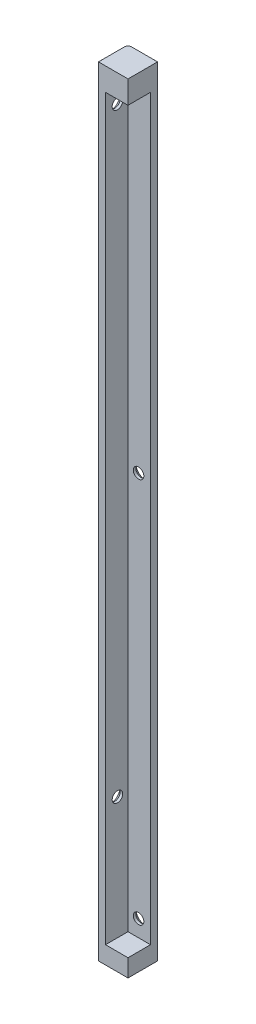
ISO-10303-21;
HEADER;
FILE_DESCRIPTION(('STEP AP214'),'2;1');
FILE_NAME('part.step','',(''),(''),'','','');
FILE_SCHEMA(('AUTOMOTIVE_DESIGN { 1 0 10303 214 1 1 1 1 }'));
ENDSEC;
DATA;
#1=APPLICATION_CONTEXT('core data for automotive mechanical design processes');
#2=APPLICATION_PROTOCOL_DEFINITION('international standard','automotive_design',2000,#1);
#3=PRODUCT_CONTEXT('',#1,'mechanical');
#4=PRODUCT('Part','Part','',(#3));
#5=PRODUCT_RELATED_PRODUCT_CATEGORY('part','',(#4));
#6=PRODUCT_DEFINITION_FORMATION('','',#4);
#7=PRODUCT_DEFINITION_CONTEXT('part definition',#1,'design');
#8=PRODUCT_DEFINITION('design','',#6,#7);
#9=PRODUCT_DEFINITION_SHAPE('','',#8);
#10=(LENGTH_UNIT() NAMED_UNIT(*) SI_UNIT(.MILLI.,.METRE.));
#11=(NAMED_UNIT(*) PLANE_ANGLE_UNIT() SI_UNIT($,.RADIAN.));
#12=(NAMED_UNIT(*) SI_UNIT($,.STERADIAN.) SOLID_ANGLE_UNIT());
#13=UNCERTAINTY_MEASURE_WITH_UNIT(LENGTH_MEASURE(1.E-05),#10,'distance_accuracy_value','');
#14=(GEOMETRIC_REPRESENTATION_CONTEXT(3) GLOBAL_UNCERTAINTY_ASSIGNED_CONTEXT((#13)) GLOBAL_UNIT_ASSIGNED_CONTEXT((#10,
#11,#12)) REPRESENTATION_CONTEXT('',''));
#15=CARTESIAN_POINT('',(0.,0.,0.));
#16=DIRECTION('',(0.,0.,1.));
#17=DIRECTION('',(1.,0.,0.));
#18=AXIS2_PLACEMENT_3D('',#15,#16,#17);
#19=CARTESIAN_POINT('',(2.,221.5,0.));
#20=DIRECTION('',(-1.,0.,0.));
#21=DIRECTION('',(0.,0.,1.));
#22=AXIS2_PLACEMENT_3D('',#19,#20,#21);
#23=PLANE('',#22);
#24=CARTESIAN_POINT('',(2.,210.999999999999,-4.00000000000108));
#25=DIRECTION('',(-1.,0.,0.));
#26=DIRECTION('',(0.,0.,1.));
#27=AXIS2_PLACEMENT_3D('',#24,#25,#26);
#28=CIRCLE('',#27,1.5);
#29=CARTESIAN_POINT('',(2.,210.999999999999,-2.50000000000108));
#30=VERTEX_POINT('',#29);
#31=EDGE_CURVE('E186',#30,#30,#28,.T.);
#32=ORIENTED_EDGE('',*,*,#31,.T.);
#33=EDGE_LOOP('',(#32));
#34=FACE_BOUND('',#33,.T.);
#35=CARTESIAN_POINT('',(2.,40.249999999999,-3.99999999999999));
#36=DIRECTION('',(-1.,0.,0.));
#37=DIRECTION('',(0.,0.,1.));
#38=AXIS2_PLACEMENT_3D('',#35,#36,#37);
#39=CIRCLE('',#38,1.5);
#40=CARTESIAN_POINT('',(2.,40.249999999999,-2.49999999999999));
#41=VERTEX_POINT('',#40);
#42=EDGE_CURVE('E193',#41,#41,#39,.T.);
#43=ORIENTED_EDGE('',*,*,#42,.T.);
#44=EDGE_LOOP('',(#43));
#45=FACE_BOUND('',#44,.T.);
#46=DIRECTION('',(0.,0.,1.));
#47=VECTOR('',#46,1.);
#48=CARTESIAN_POINT('',(2.,215.5,0.));
#49=LINE('',#48,#47);
#50=CARTESIAN_POINT('',(2.,215.5,-7.));
#51=VERTEX_POINT('',#50);
#52=CARTESIAN_POINT('',(2.,215.5,-0.599999999999999));
#53=VERTEX_POINT('',#52);
#54=EDGE_CURVE('E158',#51,#53,#49,.T.);
#55=ORIENTED_EDGE('',*,*,#54,.T.);
#56=DIRECTION('',(0.,-1.,0.));
#57=VECTOR('',#56,1.);
#58=CARTESIAN_POINT('',(2.,221.5,-0.6));
#59=LINE('',#58,#57);
#60=CARTESIAN_POINT('',(2.,5.50000000000001,-0.599999999999973));
#61=VERTEX_POINT('',#60);
#62=EDGE_CURVE('E151',#53,#61,#59,.T.);
#63=ORIENTED_EDGE('',*,*,#62,.T.);
#64=DIRECTION('',(0.,0.,-1.));
#65=VECTOR('',#64,1.);
#66=CARTESIAN_POINT('',(2.,5.50000000000001,0.));
#67=LINE('',#66,#65);
#68=CARTESIAN_POINT('',(2.,5.50000000000001,-7.));
#69=VERTEX_POINT('',#68);
#70=EDGE_CURVE('E164',#61,#69,#67,.T.);
#71=ORIENTED_EDGE('',*,*,#70,.T.);
#72=DIRECTION('',(0.,-1.,0.));
#73=VECTOR('',#72,1.);
#74=CARTESIAN_POINT('',(2.,221.5,-7.));
#75=LINE('',#74,#73);
#76=EDGE_CURVE('E194',#51,#69,#75,.T.);
#77=ORIENTED_EDGE('',*,*,#76,.F.);
#78=EDGE_LOOP('',(#55,#63,#71,#77));
#79=FACE_BOUND('',#78,.T.);
#80=ADVANCED_FACE('F35',(#34,#45,#79),#23,.F.);
#81=CARTESIAN_POINT('',(2.,221.5,-7.));
#82=DIRECTION('',(0.,0.,-1.));
#83=DIRECTION('',(-1.,0.,0.));
#84=AXIS2_PLACEMENT_3D('',#81,#82,#83);
#85=PLANE('',#84);
#86=CARTESIAN_POINT('',(4.99999999999569,10.249999999999,-7.));
#87=DIRECTION('',(0.,0.,-1.));
#88=DIRECTION('',(-1.,0.,0.));
#89=AXIS2_PLACEMENT_3D('',#86,#87,#88);
#90=CIRCLE('',#89,1.5);
#91=CARTESIAN_POINT('',(3.49999999999569,10.249999999999,-7.));
#92=VERTEX_POINT('',#91);
#93=EDGE_CURVE('E172',#92,#92,#90,.T.);
#94=ORIENTED_EDGE('',*,*,#93,.T.);
#95=EDGE_LOOP('',(#94));
#96=FACE_BOUND('',#95,.T.);
#97=CARTESIAN_POINT('',(5.00000000000042,119.999999999999,-7.));
#98=DIRECTION('',(0.,0.,-1.));
#99=DIRECTION('',(-1.,0.,0.));
#100=AXIS2_PLACEMENT_3D('',#97,#98,#99);
#101=CIRCLE('',#100,1.5);
#102=CARTESIAN_POINT('',(3.50000000000042,119.999999999999,-7.));
#103=VERTEX_POINT('',#102);
#104=EDGE_CURVE('E179',#103,#103,#101,.T.);
#105=ORIENTED_EDGE('',*,*,#104,.T.);
#106=EDGE_LOOP('',(#105));
#107=FACE_BOUND('',#106,.T.);
#108=DIRECTION('',(1.,0.,0.));
#109=VECTOR('',#108,1.);
#110=CARTESIAN_POINT('',(1.,5.5,-7.));
#111=LINE('',#110,#109);
#112=CARTESIAN_POINT('',(8.4,5.50000000000001,-7.));
#113=VERTEX_POINT('',#112);
#114=EDGE_CURVE('E161',#69,#113,#111,.T.);
#115=ORIENTED_EDGE('',*,*,#114,.T.);
#116=DIRECTION('',(0.,1.,0.));
#117=VECTOR('',#116,1.);
#118=CARTESIAN_POINT('',(8.40000000000003,221.5,-7.));
#119=LINE('',#118,#117);
#120=CARTESIAN_POINT('',(8.40000000000003,215.5,-7.));
#121=VERTEX_POINT('',#120);
#122=EDGE_CURVE('E138',#113,#121,#119,.T.);
#123=ORIENTED_EDGE('',*,*,#122,.T.);
#124=DIRECTION('',(-1.,0.,0.));
#125=VECTOR('',#124,1.);
#126=CARTESIAN_POINT('',(2.,215.5,-7.));
#127=LINE('',#126,#125);
#128=EDGE_CURVE('E156',#121,#51,#127,.T.);
#129=ORIENTED_EDGE('',*,*,#128,.T.);
#130=ORIENTED_EDGE('',*,*,#76,.T.);
#131=EDGE_LOOP('',(#115,#123,#129,#130));
#132=FACE_BOUND('',#131,.T.);
#133=ADVANCED_FACE('F229',(#96,#107,#132),#85,.F.);
#134=CARTESIAN_POINT('',(0.,221.5,-9.));
#135=DIRECTION('',(0.,0.,1.));
#136=DIRECTION('',(1.,0.,0.));
#137=AXIS2_PLACEMENT_3D('',#134,#135,#136);
#138=PLANE('',#137);
#139=CARTESIAN_POINT('',(4.99999999999569,10.249999999999,-9.));
#140=DIRECTION('',(0.,0.,-1.));
#141=DIRECTION('',(-1.,0.,0.));
#142=AXIS2_PLACEMENT_3D('',#139,#140,#141);
#143=CIRCLE('',#142,2.75);
#144=CARTESIAN_POINT('',(2.24999999999569,10.249999999999,-9.));
#145=VERTEX_POINT('',#144);
#146=EDGE_CURVE('E166',#145,#145,#143,.T.);
#147=ORIENTED_EDGE('',*,*,#146,.F.);
#148=EDGE_LOOP('',(#147));
#149=FACE_BOUND('',#148,.T.);
#150=CARTESIAN_POINT('',(5.00000000000042,119.999999999999,-9.));
#151=DIRECTION('',(0.,0.,-1.));
#152=DIRECTION('',(-1.,0.,0.));
#153=AXIS2_PLACEMENT_3D('',#150,#151,#152);
#154=CIRCLE('',#153,2.75);
#155=CARTESIAN_POINT('',(2.25000000000042,119.999999999999,-9.));
#156=VERTEX_POINT('',#155);
#157=EDGE_CURVE('E173',#156,#156,#154,.T.);
#158=ORIENTED_EDGE('',*,*,#157,.F.);
#159=EDGE_LOOP('',(#158));
#160=FACE_BOUND('',#159,.T.);
#161=DIRECTION('',(1.,0.,0.));
#162=VECTOR('',#161,1.);
#163=CARTESIAN_POINT('',(1.,0.499999999999997,-9.));
#164=LINE('',#163,#162);
#165=CARTESIAN_POINT('',(1.,0.499999999999997,-9.));
#166=VERTEX_POINT('',#165);
#167=CARTESIAN_POINT('',(8.4,0.499999999999997,-9.));
#168=VERTEX_POINT('',#167);
#169=EDGE_CURVE('E105',#166,#168,#164,.T.);
#170=ORIENTED_EDGE('',*,*,#169,.F.);
#171=DIRECTION('',(0.,1.,0.));
#172=VECTOR('',#171,1.);
#173=CARTESIAN_POINT('',(1.,221.5,-9.));
#174=LINE('',#173,#172);
#175=CARTESIAN_POINT('',(1.,222.,-9.));
#176=VERTEX_POINT('',#175);
#177=EDGE_CURVE('E210',#166,#176,#174,.T.);
#178=ORIENTED_EDGE('',*,*,#177,.T.);
#179=DIRECTION('',(1.,0.,0.));
#180=VECTOR('',#179,1.);
#181=CARTESIAN_POINT('',(0.,222.,-9.));
#182=LINE('',#181,#180);
#183=CARTESIAN_POINT('',(8.4,222.,-9.));
#184=VERTEX_POINT('',#183);
#185=EDGE_CURVE('E120',#176,#184,#182,.T.);
#186=ORIENTED_EDGE('',*,*,#185,.T.);
#187=DIRECTION('',(0.,1.,0.));
#188=VECTOR('',#187,1.);
#189=CARTESIAN_POINT('',(8.40000000000003,222.,-9.));
#190=LINE('',#189,#188);
#191=EDGE_CURVE('E118',#168,#184,#190,.T.);
#192=ORIENTED_EDGE('',*,*,#191,.F.);
#193=EDGE_LOOP('',(#170,#178,#186,#192));
#194=FACE_BOUND('',#193,.T.);
#195=ADVANCED_FACE('F119',(#149,#160,#194),#138,.F.);
#196=CARTESIAN_POINT('',(0.,221.5,0.));
#197=DIRECTION('',(1.,0.,0.));
#198=DIRECTION('',(0.,0.,-1.));
#199=AXIS2_PLACEMENT_3D('',#196,#197,#198);
#200=PLANE('',#199);
#201=CARTESIAN_POINT('',(0.,210.999999999999,-4.00000000000108));
#202=DIRECTION('',(-1.,0.,0.));
#203=DIRECTION('',(0.,0.,1.));
#204=AXIS2_PLACEMENT_3D('',#201,#202,#203);
#205=CIRCLE('',#204,2.75);
#206=CARTESIAN_POINT('',(0.,210.999999999999,-1.25000000000108));
#207=VERTEX_POINT('',#206);
#208=EDGE_CURVE('E180',#207,#207,#205,.T.);
#209=ORIENTED_EDGE('',*,*,#208,.F.);
#210=EDGE_LOOP('',(#209));
#211=FACE_BOUND('',#210,.T.);
#212=CARTESIAN_POINT('',(0.,40.249999999999,-3.99999999999999));
#213=DIRECTION('',(-1.,0.,0.));
#214=DIRECTION('',(0.,0.,1.));
#215=AXIS2_PLACEMENT_3D('',#212,#213,#214);
#216=CIRCLE('',#215,2.75);
#217=CARTESIAN_POINT('',(0.,40.249999999999,-1.24999999999999));
#218=VERTEX_POINT('',#217);
#219=EDGE_CURVE('E187',#218,#218,#216,.T.);
#220=ORIENTED_EDGE('',*,*,#219,.F.);
#221=EDGE_LOOP('',(#220));
#222=FACE_BOUND('',#221,.T.);
#223=DIRECTION('',(0.,0.,1.));
#224=VECTOR('',#223,1.);
#225=CARTESIAN_POINT('',(0.,222.,-0.6));
#226=LINE('',#225,#224);
#227=CARTESIAN_POINT('',(0.,222.,-8.));
#228=VERTEX_POINT('',#227);
#229=CARTESIAN_POINT('',(0.,222.,-0.6));
#230=VERTEX_POINT('',#229);
#231=EDGE_CURVE('E143',#228,#230,#226,.T.);
#232=ORIENTED_EDGE('',*,*,#231,.F.);
#233=DIRECTION('',(0.,1.,0.));
#234=VECTOR('',#233,1.);
#235=CARTESIAN_POINT('',(0.,221.5,-8.));
#236=LINE('',#235,#234);
#237=CARTESIAN_POINT('',(0.,0.499999999999997,-8.));
#238=VERTEX_POINT('',#237);
#239=EDGE_CURVE('E43',#228,#238,#236,.F.);
#240=ORIENTED_EDGE('',*,*,#239,.T.);
#241=DIRECTION('',(0.,0.,-1.));
#242=VECTOR('',#241,1.);
#243=CARTESIAN_POINT('',(0.,0.499999999999997,-0.599999999999973));
#244=LINE('',#243,#242);
#245=CARTESIAN_POINT('',(0.,0.499999999999997,-0.599999999999973));
#246=VERTEX_POINT('',#245);
#247=EDGE_CURVE('E124',#246,#238,#244,.T.);
#248=ORIENTED_EDGE('',*,*,#247,.F.);
#249=DIRECTION('',(0.,-1.,0.));
#250=VECTOR('',#249,1.);
#251=CARTESIAN_POINT('',(0.,224.,-0.6));
#252=LINE('',#251,#250);
#253=EDGE_CURVE('E146',#230,#246,#252,.T.);
#254=ORIENTED_EDGE('',*,*,#253,.F.);
#255=EDGE_LOOP('',(#232,#240,#248,#254));
#256=FACE_BOUND('',#255,.T.);
#257=ADVANCED_FACE('F234',(#211,#222,#256),#200,.F.);
#258=CARTESIAN_POINT('',(0.,40.249999999999,-3.99999999999999));
#259=DIRECTION('',(-1.,0.,0.));
#260=DIRECTION('',(0.,0.,1.));
#261=AXIS2_PLACEMENT_3D('',#258,#259,#260);
#262=CYLINDRICAL_SURFACE('',#261,1.5);
#263=CARTESIAN_POINT('',(1.25,40.249999999999,-3.99999999999999));
#264=DIRECTION('',(-1.,0.,0.));
#265=DIRECTION('',(0.,0.,1.));
#266=AXIS2_PLACEMENT_3D('',#263,#264,#265);
#267=CIRCLE('',#266,1.5);
#268=CARTESIAN_POINT('',(1.25,40.249999999999,-2.49999999999999));
#269=VERTEX_POINT('',#268);
#270=EDGE_CURVE('E190',#269,#269,#267,.T.);
#271=ORIENTED_EDGE('',*,*,#270,.T.);
#272=EDGE_LOOP('',(#271));
#273=FACE_BOUND('',#272,.T.);
#274=ORIENTED_EDGE('',*,*,#42,.F.);
#275=EDGE_LOOP('',(#274));
#276=FACE_BOUND('',#275,.T.);
#277=ADVANCED_FACE('F254',(#273,#276),#262,.F.);
#278=CARTESIAN_POINT('',(0.,40.249999999999,-3.99999999999999));
#279=DIRECTION('',(-1.,0.,0.));
#280=DIRECTION('',(0.,0.,1.));
#281=AXIS2_PLACEMENT_3D('',#278,#279,#280);
#282=CONICAL_SURFACE('',#281,2.75,0.785398163397449);
#283=ORIENTED_EDGE('',*,*,#270,.F.);
#284=EDGE_LOOP('',(#283));
#285=FACE_BOUND('',#284,.T.);
#286=ORIENTED_EDGE('',*,*,#219,.T.);
#287=EDGE_LOOP('',(#286));
#288=FACE_BOUND('',#287,.T.);
#289=ADVANCED_FACE('F258',(#285,#288),#282,.F.);
#290=CARTESIAN_POINT('',(0.,210.999999999999,-4.00000000000108));
#291=DIRECTION('',(-1.,0.,0.));
#292=DIRECTION('',(0.,0.,1.));
#293=AXIS2_PLACEMENT_3D('',#290,#291,#292);
#294=CYLINDRICAL_SURFACE('',#293,1.5);
#295=CARTESIAN_POINT('',(1.25,210.999999999999,-4.00000000000108));
#296=DIRECTION('',(-1.,0.,0.));
#297=DIRECTION('',(0.,0.,1.));
#298=AXIS2_PLACEMENT_3D('',#295,#296,#297);
#299=CIRCLE('',#298,1.5);
#300=CARTESIAN_POINT('',(1.25,210.999999999999,-2.50000000000108));
#301=VERTEX_POINT('',#300);
#302=EDGE_CURVE('E183',#301,#301,#299,.T.);
#303=ORIENTED_EDGE('',*,*,#302,.T.);
#304=EDGE_LOOP('',(#303));
#305=FACE_BOUND('',#304,.T.);
#306=ORIENTED_EDGE('',*,*,#31,.F.);
#307=EDGE_LOOP('',(#306));
#308=FACE_BOUND('',#307,.T.);
#309=ADVANCED_FACE('F262',(#305,#308),#294,.F.);
#310=CARTESIAN_POINT('',(0.,210.999999999999,-4.00000000000108));
#311=DIRECTION('',(-1.,0.,0.));
#312=DIRECTION('',(0.,0.,1.));
#313=AXIS2_PLACEMENT_3D('',#310,#311,#312);
#314=CONICAL_SURFACE('',#313,2.75,0.785398163397449);
#315=ORIENTED_EDGE('',*,*,#302,.F.);
#316=EDGE_LOOP('',(#315));
#317=FACE_BOUND('',#316,.T.);
#318=ORIENTED_EDGE('',*,*,#208,.T.);
#319=EDGE_LOOP('',(#318));
#320=FACE_BOUND('',#319,.T.);
#321=ADVANCED_FACE('F266',(#317,#320),#314,.F.);
#322=CARTESIAN_POINT('',(5.00000000000042,119.999999999999,-9.));
#323=DIRECTION('',(0.,0.,-1.));
#324=DIRECTION('',(-1.,0.,0.));
#325=AXIS2_PLACEMENT_3D('',#322,#323,#324);
#326=CYLINDRICAL_SURFACE('',#325,1.5);
#327=CARTESIAN_POINT('',(5.00000000000042,119.999999999999,-7.75));
#328=DIRECTION('',(0.,0.,-1.));
#329=DIRECTION('',(-1.,0.,0.));
#330=AXIS2_PLACEMENT_3D('',#327,#328,#329);
#331=CIRCLE('',#330,1.5);
#332=CARTESIAN_POINT('',(3.50000000000042,119.999999999999,-7.75));
#333=VERTEX_POINT('',#332);
#334=EDGE_CURVE('E176',#333,#333,#331,.T.);
#335=ORIENTED_EDGE('',*,*,#334,.T.);
#336=EDGE_LOOP('',(#335));
#337=FACE_BOUND('',#336,.T.);
#338=ORIENTED_EDGE('',*,*,#104,.F.);
#339=EDGE_LOOP('',(#338));
#340=FACE_BOUND('',#339,.T.);
#341=ADVANCED_FACE('F270',(#337,#340),#326,.F.);
#342=CARTESIAN_POINT('',(5.00000000000042,119.999999999999,-9.));
#343=DIRECTION('',(0.,0.,-1.));
#344=DIRECTION('',(-1.,0.,0.));
#345=AXIS2_PLACEMENT_3D('',#342,#343,#344);
#346=CONICAL_SURFACE('',#345,2.75,0.785398163397449);
#347=ORIENTED_EDGE('',*,*,#334,.F.);
#348=EDGE_LOOP('',(#347));
#349=FACE_BOUND('',#348,.T.);
#350=ORIENTED_EDGE('',*,*,#157,.T.);
#351=EDGE_LOOP('',(#350));
#352=FACE_BOUND('',#351,.T.);
#353=ADVANCED_FACE('F274',(#349,#352),#346,.F.);
#354=CARTESIAN_POINT('',(4.99999999999569,10.249999999999,-9.));
#355=DIRECTION('',(0.,0.,-1.));
#356=DIRECTION('',(-1.,0.,0.));
#357=AXIS2_PLACEMENT_3D('',#354,#355,#356);
#358=CYLINDRICAL_SURFACE('',#357,1.5);
#359=CARTESIAN_POINT('',(4.99999999999569,10.249999999999,-7.75));
#360=DIRECTION('',(0.,0.,-1.));
#361=DIRECTION('',(-1.,0.,0.));
#362=AXIS2_PLACEMENT_3D('',#359,#360,#361);
#363=CIRCLE('',#362,1.5);
#364=CARTESIAN_POINT('',(3.49999999999569,10.249999999999,-7.75));
#365=VERTEX_POINT('',#364);
#366=EDGE_CURVE('E169',#365,#365,#363,.T.);
#367=ORIENTED_EDGE('',*,*,#366,.T.);
#368=EDGE_LOOP('',(#367));
#369=FACE_BOUND('',#368,.T.);
#370=ORIENTED_EDGE('',*,*,#93,.F.);
#371=EDGE_LOOP('',(#370));
#372=FACE_BOUND('',#371,.T.);
#373=ADVANCED_FACE('F278',(#369,#372),#358,.F.);
#374=CARTESIAN_POINT('',(4.99999999999569,10.249999999999,-9.));
#375=DIRECTION('',(0.,0.,-1.));
#376=DIRECTION('',(-1.,0.,0.));
#377=AXIS2_PLACEMENT_3D('',#374,#375,#376);
#378=CONICAL_SURFACE('',#377,2.75,0.785398163397449);
#379=ORIENTED_EDGE('',*,*,#366,.F.);
#380=EDGE_LOOP('',(#379));
#381=FACE_BOUND('',#380,.T.);
#382=ORIENTED_EDGE('',*,*,#146,.T.);
#383=EDGE_LOOP('',(#382));
#384=FACE_BOUND('',#383,.T.);
#385=ADVANCED_FACE('F282',(#381,#384),#378,.F.);
#386=CARTESIAN_POINT('',(0.,5.5,0.));
#387=DIRECTION('',(0.,1.,0.));
#388=DIRECTION('',(0.,0.,1.));
#389=AXIS2_PLACEMENT_3D('',#386,#387,#388);
#390=PLANE('',#389);
#391=DIRECTION('',(0.,0.,1.));
#392=VECTOR('',#391,1.);
#393=CARTESIAN_POINT('',(8.4,5.5,0.));
#394=LINE('',#393,#392);
#395=CARTESIAN_POINT('',(8.4,5.5,-0.599999999999973));
#396=VERTEX_POINT('',#395);
#397=EDGE_CURVE('E141',#113,#396,#394,.T.);
#398=ORIENTED_EDGE('',*,*,#397,.F.);
#399=ORIENTED_EDGE('',*,*,#114,.F.);
#400=ORIENTED_EDGE('',*,*,#70,.F.);
#401=DIRECTION('',(-1.,0.,0.));
#402=VECTOR('',#401,1.);
#403=CARTESIAN_POINT('',(0.,5.5,-0.599999999999973));
#404=LINE('',#403,#402);
#405=EDGE_CURVE('E154',#396,#61,#404,.T.);
#406=ORIENTED_EDGE('',*,*,#405,.F.);
#407=EDGE_LOOP('',(#398,#399,#400,#406));
#408=FACE_BOUND('',#407,.T.);
#409=ADVANCED_FACE('F232',(#408),#390,.T.);
#410=CARTESIAN_POINT('',(0.,215.5,0.));
#411=DIRECTION('',(0.,-1.,0.));
#412=DIRECTION('',(0.,0.,-1.));
#413=AXIS2_PLACEMENT_3D('',#410,#411,#412);
#414=PLANE('',#413);
#415=DIRECTION('',(0.,0.,-1.));
#416=VECTOR('',#415,1.);
#417=CARTESIAN_POINT('',(8.40000000000003,215.5,0.));
#418=LINE('',#417,#416);
#419=CARTESIAN_POINT('',(8.40000000000003,215.5,-0.599999999999999));
#420=VERTEX_POINT('',#419);
#421=EDGE_CURVE('E136',#420,#121,#418,.T.);
#422=ORIENTED_EDGE('',*,*,#421,.F.);
#423=DIRECTION('',(1.,0.,0.));
#424=VECTOR('',#423,1.);
#425=CARTESIAN_POINT('',(0.,215.5,-0.599999999999999));
#426=LINE('',#425,#424);
#427=EDGE_CURVE('E148',#53,#420,#426,.T.);
#428=ORIENTED_EDGE('',*,*,#427,.F.);
#429=ORIENTED_EDGE('',*,*,#54,.F.);
#430=ORIENTED_EDGE('',*,*,#128,.F.);
#431=EDGE_LOOP('',(#422,#428,#429,#430));
#432=FACE_BOUND('',#431,.T.);
#433=ADVANCED_FACE('F222',(#432),#414,.T.);
#434=CARTESIAN_POINT('',(10.,224.,-0.6));
#435=DIRECTION('',(0.,0.,-1.));
#436=DIRECTION('',(0.,1.,0.));
#437=AXIS2_PLACEMENT_3D('',#434,#435,#436);
#438=PLANE('',#437);
#439=ORIENTED_EDGE('',*,*,#253,.T.);
#440=DIRECTION('',(-1.,0.,0.));
#441=VECTOR('',#440,1.);
#442=CARTESIAN_POINT('',(8.4,0.499999999999997,-0.599999999999972));
#443=LINE('',#442,#441);
#444=CARTESIAN_POINT('',(8.4,0.499999999999997,-0.599999999999972));
#445=VERTEX_POINT('',#444);
#446=EDGE_CURVE('E129',#445,#246,#443,.T.);
#447=ORIENTED_EDGE('',*,*,#446,.F.);
#448=DIRECTION('',(0.,1.,0.));
#449=VECTOR('',#448,1.);
#450=CARTESIAN_POINT('',(8.40000000000003,224.,-0.6));
#451=LINE('',#450,#449);
#452=EDGE_CURVE('E128',#445,#396,#451,.T.);
#453=ORIENTED_EDGE('',*,*,#452,.T.);
#454=ORIENTED_EDGE('',*,*,#405,.T.);
#455=ORIENTED_EDGE('',*,*,#62,.F.);
#456=ORIENTED_EDGE('',*,*,#427,.T.);
#457=CARTESIAN_POINT('',(8.40000000000003,222.,-0.6));
#458=VERTEX_POINT('',#457);
#459=EDGE_CURVE('E123',#420,#458,#451,.T.);
#460=ORIENTED_EDGE('',*,*,#459,.T.);
#461=DIRECTION('',(-1.,0.,0.));
#462=VECTOR('',#461,1.);
#463=CARTESIAN_POINT('',(10.,222.,-0.6));
#464=LINE('',#463,#462);
#465=EDGE_CURVE('E197',#458,#230,#464,.T.);
#466=ORIENTED_EDGE('',*,*,#465,.T.);
#467=EDGE_LOOP('',(#439,#447,#453,#454,#455,#456,#460,#466));
#468=FACE_BOUND('',#467,.T.);
#469=ADVANCED_FACE('F217',(#468),#438,.F.);
#470=CARTESIAN_POINT('',(10.,222.,-0.6));
#471=DIRECTION('',(0.,-1.,0.));
#472=DIRECTION('',(0.,0.,-1.));
#473=AXIS2_PLACEMENT_3D('',#470,#471,#472);
#474=PLANE('',#473);
#475=ORIENTED_EDGE('',*,*,#185,.F.);
#476=CARTESIAN_POINT('',(1.,222.,-8.));
#477=DIRECTION('',(0.,-1.,0.));
#478=DIRECTION('',(0.,0.,-1.));
#479=AXIS2_PLACEMENT_3D('',#476,#477,#478);
#480=CIRCLE('',#479,1.);
#481=EDGE_CURVE('E57',#176,#228,#480,.F.);
#482=ORIENTED_EDGE('',*,*,#481,.T.);
#483=ORIENTED_EDGE('',*,*,#231,.T.);
#484=ORIENTED_EDGE('',*,*,#465,.F.);
#485=DIRECTION('',(0.,0.,-1.));
#486=VECTOR('',#485,1.);
#487=CARTESIAN_POINT('',(8.40000000000003,222.,-0.6));
#488=LINE('',#487,#486);
#489=EDGE_CURVE('E208',#458,#184,#488,.T.);
#490=ORIENTED_EDGE('',*,*,#489,.T.);
#491=EDGE_LOOP('',(#475,#482,#483,#484,#490));
#492=FACE_BOUND('',#491,.T.);
#493=ADVANCED_FACE('F213',(#492),#474,.F.);
#494=CARTESIAN_POINT('',(8.40000000000003,222.,1.));
#495=DIRECTION('',(-1.,0.,0.));
#496=DIRECTION('',(0.,-1.,0.));
#497=AXIS2_PLACEMENT_3D('',#494,#495,#496);
#498=PLANE('',#497);
#499=ORIENTED_EDGE('',*,*,#452,.F.);
#500=DIRECTION('',(0.,0.,1.));
#501=VECTOR('',#500,1.);
#502=CARTESIAN_POINT('',(8.4,0.499999999999997,-9.));
#503=LINE('',#502,#501);
#504=EDGE_CURVE('E110',#168,#445,#503,.T.);
#505=ORIENTED_EDGE('',*,*,#504,.F.);
#506=ORIENTED_EDGE('',*,*,#191,.T.);
#507=ORIENTED_EDGE('',*,*,#489,.F.);
#508=ORIENTED_EDGE('',*,*,#459,.F.);
#509=ORIENTED_EDGE('',*,*,#421,.T.);
#510=ORIENTED_EDGE('',*,*,#122,.F.);
#511=ORIENTED_EDGE('',*,*,#397,.T.);
#512=EDGE_LOOP('',(#499,#505,#506,#507,#508,#509,#510,#511));
#513=FACE_BOUND('',#512,.T.);
#514=ADVANCED_FACE('F126',(#513),#498,.F.);
#515=CARTESIAN_POINT('',(0.,0.499999999999997,0.));
#516=DIRECTION('',(0.,-1.,0.));
#517=DIRECTION('',(0.,0.,-1.));
#518=AXIS2_PLACEMENT_3D('',#515,#516,#517);
#519=PLANE('',#518);
#520=ORIENTED_EDGE('',*,*,#247,.T.);
#521=CARTESIAN_POINT('',(1.,0.5,-8.));
#522=DIRECTION('',(0.,-1.,0.));
#523=DIRECTION('',(0.,0.,-1.));
#524=AXIS2_PLACEMENT_3D('',#521,#522,#523);
#525=CIRCLE('',#524,1.);
#526=EDGE_CURVE('E11',#238,#166,#525,.T.);
#527=ORIENTED_EDGE('',*,*,#526,.T.);
#528=ORIENTED_EDGE('',*,*,#169,.T.);
#529=ORIENTED_EDGE('',*,*,#504,.T.);
#530=ORIENTED_EDGE('',*,*,#446,.T.);
#531=EDGE_LOOP('',(#520,#527,#528,#529,#530));
#532=FACE_BOUND('',#531,.T.);
#533=ADVANCED_FACE('F107',(#532),#519,.T.);
#534=CARTESIAN_POINT('',(1.,221.5,-8.));
#535=DIRECTION('',(0.,1.,0.));
#536=DIRECTION('',(0.,0.,1.));
#537=AXIS2_PLACEMENT_3D('',#534,#535,#536);
#538=CYLINDRICAL_SURFACE('',#537,1.);
#539=ORIENTED_EDGE('',*,*,#526,.F.);
#540=ORIENTED_EDGE('',*,*,#239,.F.);
#541=ORIENTED_EDGE('',*,*,#481,.F.);
#542=ORIENTED_EDGE('',*,*,#177,.F.);
#543=EDGE_LOOP('',(#539,#540,#541,#542));
#544=FACE_BOUND('',#543,.T.);
#545=ADVANCED_FACE('F37',(#544),#538,.T.);
#546=CLOSED_SHELL('',(#80,#133,#195,#257,#277,#289,#309,#321,#341,#353,#373,#385,#409,#433,#469,
#493,#514,#533,#545));
#547=MANIFOLD_SOLID_BREP('B2',#546);
#548=ADVANCED_BREP_SHAPE_REPRESENTATION('',(#18,#547),#14);
#549=SHAPE_DEFINITION_REPRESENTATION(#9,#548);
ENDSEC;
END-ISO-10303-21;
